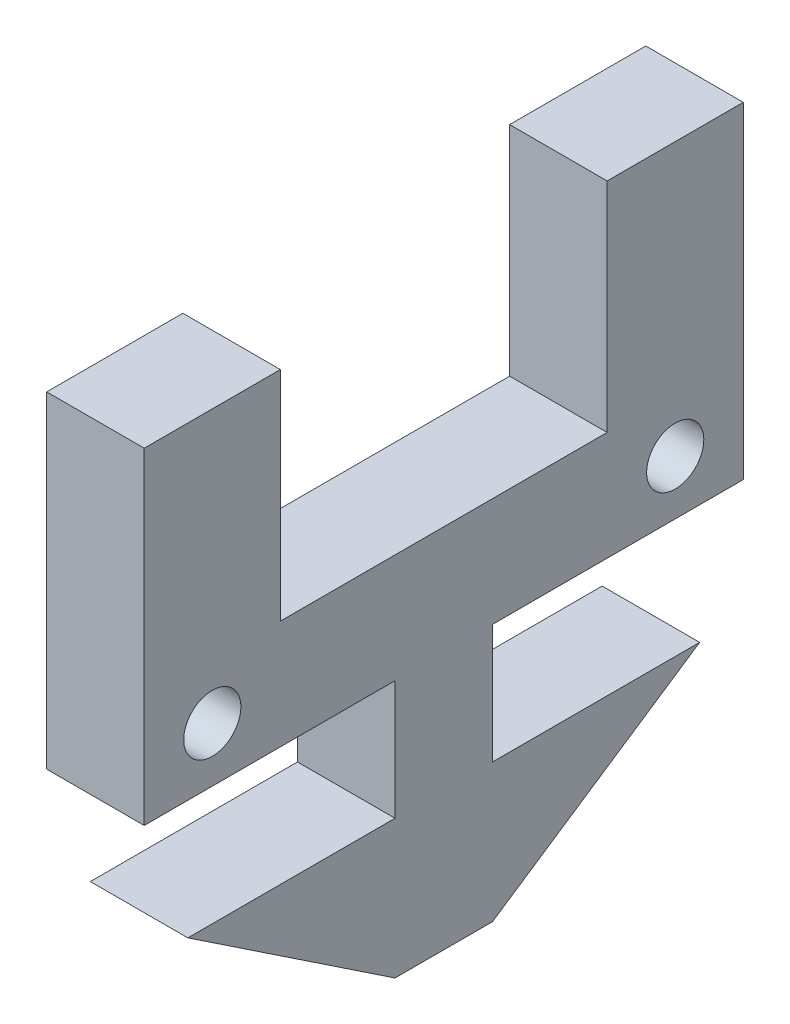
ISO-10303-21;
HEADER;
FILE_DESCRIPTION(('STEP AP214'),'2;1');
FILE_NAME('part.step','',(''),(''),'','','');
FILE_SCHEMA(('AUTOMOTIVE_DESIGN { 1 0 10303 214 1 1 1 1 }'));
ENDSEC;
DATA;
#1=APPLICATION_CONTEXT('core data for automotive mechanical design processes');
#2=APPLICATION_PROTOCOL_DEFINITION('international standard','automotive_design',2000,#1);
#3=PRODUCT_CONTEXT('',#1,'mechanical');
#4=PRODUCT('Part','Part','',(#3));
#5=PRODUCT_RELATED_PRODUCT_CATEGORY('part','',(#4));
#6=PRODUCT_DEFINITION_FORMATION('','',#4);
#7=PRODUCT_DEFINITION_CONTEXT('part definition',#1,'design');
#8=PRODUCT_DEFINITION('design','',#6,#7);
#9=PRODUCT_DEFINITION_SHAPE('','',#8);
#10=(LENGTH_UNIT() NAMED_UNIT(*) SI_UNIT(.MILLI.,.METRE.));
#11=(NAMED_UNIT(*) PLANE_ANGLE_UNIT() SI_UNIT($,.RADIAN.));
#12=(NAMED_UNIT(*) SI_UNIT($,.STERADIAN.) SOLID_ANGLE_UNIT());
#13=UNCERTAINTY_MEASURE_WITH_UNIT(LENGTH_MEASURE(1.E-05),#10,'distance_accuracy_value','');
#14=(GEOMETRIC_REPRESENTATION_CONTEXT(3) GLOBAL_UNCERTAINTY_ASSIGNED_CONTEXT((#13)) GLOBAL_UNIT_ASSIGNED_CONTEXT((#10,
#11,#12)) REPRESENTATION_CONTEXT('',''));
#15=CARTESIAN_POINT('',(0.,0.,0.));
#16=DIRECTION('',(0.,0.,1.));
#17=DIRECTION('',(1.,0.,0.));
#18=AXIS2_PLACEMENT_3D('',#15,#16,#17);
#19=CARTESIAN_POINT('',(3.5814,-6.,11.));
#20=DIRECTION('',(0.,1.,0.));
#21=DIRECTION('',(0.,0.,1.));
#22=AXIS2_PLACEMENT_3D('',#19,#20,#21);
#23=PLANE('',#22);
#24=DIRECTION('',(-1.,0.,0.));
#25=VECTOR('',#24,1.);
#26=CARTESIAN_POINT('',(24.6215187167755,-6.,1.7907));
#27=LINE('',#26,#25);
#28=CARTESIAN_POINT('',(3.5814,-6.,1.7907));
#29=VERTEX_POINT('',#28);
#30=CARTESIAN_POINT('',(0.,-6.,1.7907));
#31=VERTEX_POINT('',#30);
#32=EDGE_CURVE('E56',#29,#31,#27,.T.);
#33=ORIENTED_EDGE('',*,*,#32,.F.);
#34=DIRECTION('',(0.,0.,-1.));
#35=VECTOR('',#34,1.);
#36=CARTESIAN_POINT('',(3.5814,-6.,11.));
#37=LINE('',#36,#35);
#38=CARTESIAN_POINT('',(3.5814,-6.,11.));
#39=VERTEX_POINT('',#38);
#40=EDGE_CURVE('E230',#39,#29,#37,.T.);
#41=ORIENTED_EDGE('',*,*,#40,.F.);
#42=DIRECTION('',(-1.,0.,0.));
#43=VECTOR('',#42,1.);
#44=CARTESIAN_POINT('',(3.5814,-6.,11.));
#45=LINE('',#44,#43);
#46=CARTESIAN_POINT('',(0.,-6.,11.));
#47=VERTEX_POINT('',#46);
#48=EDGE_CURVE('E256',#39,#47,#45,.T.);
#49=ORIENTED_EDGE('',*,*,#48,.T.);
#50=DIRECTION('',(0.,0.,-1.));
#51=VECTOR('',#50,1.);
#52=CARTESIAN_POINT('',(0.,-6.,11.));
#53=LINE('',#52,#51);
#54=EDGE_CURVE('E248',#47,#31,#53,.T.);
#55=ORIENTED_EDGE('',*,*,#54,.T.);
#56=EDGE_LOOP('',(#33,#41,#49,#55));
#57=FACE_BOUND('',#56,.T.);
#58=ADVANCED_FACE('F33',(#57),#23,.F.);
#59=CARTESIAN_POINT('',(3.5814,6.,-6.));
#60=DIRECTION('',(0.,-1.,0.));
#61=DIRECTION('',(0.,0.,-1.));
#62=AXIS2_PLACEMENT_3D('',#59,#60,#61);
#63=PLANE('',#62);
#64=DIRECTION('',(0.,0.,1.));
#65=VECTOR('',#64,1.);
#66=CARTESIAN_POINT('',(0.,6.,-6.));
#67=LINE('',#66,#65);
#68=CARTESIAN_POINT('',(0.,6.,-11.));
#69=VERTEX_POINT('',#68);
#70=CARTESIAN_POINT('',(0.,6.,-6.));
#71=VERTEX_POINT('',#70);
#72=EDGE_CURVE('E211',#69,#71,#67,.T.);
#73=ORIENTED_EDGE('',*,*,#72,.T.);
#74=DIRECTION('',(-1.,0.,0.));
#75=VECTOR('',#74,1.);
#76=CARTESIAN_POINT('',(3.5814,6.,-6.));
#77=LINE('',#76,#75);
#78=CARTESIAN_POINT('',(3.5814,6.,-6.));
#79=VERTEX_POINT('',#78);
#80=EDGE_CURVE('E11',#79,#71,#77,.T.);
#81=ORIENTED_EDGE('',*,*,#80,.F.);
#82=DIRECTION('',(0.,0.,1.));
#83=VECTOR('',#82,1.);
#84=CARTESIAN_POINT('',(3.5814,6.,-6.));
#85=LINE('',#84,#83);
#86=CARTESIAN_POINT('',(3.5814,6.,-11.));
#87=VERTEX_POINT('',#86);
#88=EDGE_CURVE('E217',#87,#79,#85,.T.);
#89=ORIENTED_EDGE('',*,*,#88,.F.);
#90=DIRECTION('',(-1.,0.,0.));
#91=VECTOR('',#90,1.);
#92=CARTESIAN_POINT('',(3.5814,6.,-11.));
#93=LINE('',#92,#91);
#94=EDGE_CURVE('E234',#87,#69,#93,.T.);
#95=ORIENTED_EDGE('',*,*,#94,.T.);
#96=EDGE_LOOP('',(#73,#81,#89,#95));
#97=FACE_BOUND('',#96,.T.);
#98=ADVANCED_FACE('F35',(#97),#63,.F.);
#99=CARTESIAN_POINT('',(3.5814,-2.,-6.));
#100=DIRECTION('',(0.,0.,-1.));
#101=DIRECTION('',(0.,1.,0.));
#102=AXIS2_PLACEMENT_3D('',#99,#100,#101);
#103=PLANE('',#102);
#104=DIRECTION('',(0.,-1.,0.));
#105=VECTOR('',#104,1.);
#106=CARTESIAN_POINT('',(0.,-2.,-6.));
#107=LINE('',#106,#105);
#108=CARTESIAN_POINT('',(0.,-2.,-6.));
#109=VERTEX_POINT('',#108);
#110=EDGE_CURVE('E237',#71,#109,#107,.T.);
#111=ORIENTED_EDGE('',*,*,#110,.T.);
#112=DIRECTION('',(-1.,0.,0.));
#113=VECTOR('',#112,1.);
#114=CARTESIAN_POINT('',(3.5814,-2.,-6.));
#115=LINE('',#114,#113);
#116=CARTESIAN_POINT('',(3.5814,-2.,-6.));
#117=VERTEX_POINT('',#116);
#118=EDGE_CURVE('E41',#117,#109,#115,.T.);
#119=ORIENTED_EDGE('',*,*,#118,.F.);
#120=DIRECTION('',(0.,-1.,0.));
#121=VECTOR('',#120,1.);
#122=CARTESIAN_POINT('',(3.5814,-2.,-6.));
#123=LINE('',#122,#121);
#124=EDGE_CURVE('E219',#79,#117,#123,.T.);
#125=ORIENTED_EDGE('',*,*,#124,.F.);
#126=ORIENTED_EDGE('',*,*,#80,.T.);
#127=EDGE_LOOP('',(#111,#119,#125,#126));
#128=FACE_BOUND('',#127,.T.);
#129=ADVANCED_FACE('F293',(#128),#103,.F.);
#130=CARTESIAN_POINT('',(3.5814,-2.,6.));
#131=DIRECTION('',(0.,-1.,0.));
#132=DIRECTION('',(0.,0.,-1.));
#133=AXIS2_PLACEMENT_3D('',#130,#131,#132);
#134=PLANE('',#133);
#135=DIRECTION('',(0.,0.,1.));
#136=VECTOR('',#135,1.);
#137=CARTESIAN_POINT('',(0.,-2.,6.));
#138=LINE('',#137,#136);
#139=CARTESIAN_POINT('',(0.,-2.,6.));
#140=VERTEX_POINT('',#139);
#141=EDGE_CURVE('E239',#109,#140,#138,.T.);
#142=ORIENTED_EDGE('',*,*,#141,.T.);
#143=DIRECTION('',(-1.,0.,0.));
#144=VECTOR('',#143,1.);
#145=CARTESIAN_POINT('',(3.5814,-2.,6.));
#146=LINE('',#145,#144);
#147=CARTESIAN_POINT('',(3.5814,-2.,6.));
#148=VERTEX_POINT('',#147);
#149=EDGE_CURVE('E265',#148,#140,#146,.T.);
#150=ORIENTED_EDGE('',*,*,#149,.F.);
#151=DIRECTION('',(0.,0.,1.));
#152=VECTOR('',#151,1.);
#153=CARTESIAN_POINT('',(3.5814,-2.,6.));
#154=LINE('',#153,#152);
#155=EDGE_CURVE('E222',#117,#148,#154,.T.);
#156=ORIENTED_EDGE('',*,*,#155,.F.);
#157=ORIENTED_EDGE('',*,*,#118,.T.);
#158=EDGE_LOOP('',(#142,#150,#156,#157));
#159=FACE_BOUND('',#158,.T.);
#160=ADVANCED_FACE('F272',(#159),#134,.F.);
#161=CARTESIAN_POINT('',(3.5814,6.,6.));
#162=DIRECTION('',(0.,0.,1.));
#163=DIRECTION('',(0.,-1.,0.));
#164=AXIS2_PLACEMENT_3D('',#161,#162,#163);
#165=PLANE('',#164);
#166=DIRECTION('',(0.,1.,0.));
#167=VECTOR('',#166,1.);
#168=CARTESIAN_POINT('',(0.,6.,6.));
#169=LINE('',#168,#167);
#170=CARTESIAN_POINT('',(0.,6.,6.));
#171=VERTEX_POINT('',#170);
#172=EDGE_CURVE('E241',#140,#171,#169,.T.);
#173=ORIENTED_EDGE('',*,*,#172,.T.);
#174=DIRECTION('',(-1.,0.,0.));
#175=VECTOR('',#174,1.);
#176=CARTESIAN_POINT('',(3.5814,6.,6.));
#177=LINE('',#176,#175);
#178=CARTESIAN_POINT('',(3.5814,6.,6.));
#179=VERTEX_POINT('',#178);
#180=EDGE_CURVE('E262',#179,#171,#177,.T.);
#181=ORIENTED_EDGE('',*,*,#180,.F.);
#182=DIRECTION('',(0.,1.,0.));
#183=VECTOR('',#182,1.);
#184=CARTESIAN_POINT('',(3.5814,6.,6.));
#185=LINE('',#184,#183);
#186=EDGE_CURVE('E224',#148,#179,#185,.T.);
#187=ORIENTED_EDGE('',*,*,#186,.F.);
#188=ORIENTED_EDGE('',*,*,#149,.T.);
#189=EDGE_LOOP('',(#173,#181,#187,#188));
#190=FACE_BOUND('',#189,.T.);
#191=ADVANCED_FACE('F283',(#190),#165,.F.);
#192=CARTESIAN_POINT('',(3.5814,6.,11.));
#193=DIRECTION('',(0.,-1.,0.));
#194=DIRECTION('',(0.,0.,-1.));
#195=AXIS2_PLACEMENT_3D('',#192,#193,#194);
#196=PLANE('',#195);
#197=DIRECTION('',(0.,0.,1.));
#198=VECTOR('',#197,1.);
#199=CARTESIAN_POINT('',(0.,6.,11.));
#200=LINE('',#199,#198);
#201=CARTESIAN_POINT('',(0.,6.,11.));
#202=VERTEX_POINT('',#201);
#203=EDGE_CURVE('E243',#171,#202,#200,.T.);
#204=ORIENTED_EDGE('',*,*,#203,.T.);
#205=DIRECTION('',(-1.,0.,0.));
#206=VECTOR('',#205,1.);
#207=CARTESIAN_POINT('',(3.5814,6.,11.));
#208=LINE('',#207,#206);
#209=CARTESIAN_POINT('',(3.5814,6.,11.));
#210=VERTEX_POINT('',#209);
#211=EDGE_CURVE('E259',#210,#202,#208,.T.);
#212=ORIENTED_EDGE('',*,*,#211,.F.);
#213=DIRECTION('',(0.,0.,1.));
#214=VECTOR('',#213,1.);
#215=CARTESIAN_POINT('',(3.5814,6.,11.));
#216=LINE('',#215,#214);
#217=EDGE_CURVE('E226',#179,#210,#216,.T.);
#218=ORIENTED_EDGE('',*,*,#217,.F.);
#219=ORIENTED_EDGE('',*,*,#180,.T.);
#220=EDGE_LOOP('',(#204,#212,#218,#219));
#221=FACE_BOUND('',#220,.T.);
#222=ADVANCED_FACE('F287',(#221),#196,.F.);
#223=CARTESIAN_POINT('',(3.5814,-6.,11.));
#224=DIRECTION('',(0.,0.,-1.));
#225=DIRECTION('',(-1.,0.,0.));
#226=AXIS2_PLACEMENT_3D('',#223,#224,#225);
#227=PLANE('',#226);
#228=DIRECTION('',(0.,-1.,0.));
#229=VECTOR('',#228,1.);
#230=CARTESIAN_POINT('',(0.,-6.,11.));
#231=LINE('',#230,#229);
#232=EDGE_CURVE('E245',#202,#47,#231,.T.);
#233=ORIENTED_EDGE('',*,*,#232,.T.);
#234=ORIENTED_EDGE('',*,*,#48,.F.);
#235=DIRECTION('',(0.,-1.,0.));
#236=VECTOR('',#235,1.);
#237=CARTESIAN_POINT('',(3.5814,-6.,11.));
#238=LINE('',#237,#236);
#239=EDGE_CURVE('E228',#210,#39,#238,.T.);
#240=ORIENTED_EDGE('',*,*,#239,.F.);
#241=ORIENTED_EDGE('',*,*,#211,.T.);
#242=EDGE_LOOP('',(#233,#234,#240,#241));
#243=FACE_BOUND('',#242,.T.);
#244=ADVANCED_FACE('F333',(#243),#227,.F.);
#245=CARTESIAN_POINT('',(3.5814,-6.,-1.7907));
#246=VERTEX_POINT('',#245);
#247=CARTESIAN_POINT('',(3.5814,-6.,-11.));
#248=VERTEX_POINT('',#247);
#249=EDGE_CURVE('E48',#246,#248,#37,.T.);
#250=ORIENTED_EDGE('',*,*,#249,.F.);
#251=DIRECTION('',(-1.,0.,0.));
#252=VECTOR('',#251,1.);
#253=CARTESIAN_POINT('',(24.6215187167755,-6.,-1.7907));
#254=LINE('',#253,#252);
#255=CARTESIAN_POINT('',(0.,-6.,-1.7907));
#256=VERTEX_POINT('',#255);
#257=EDGE_CURVE('E195',#246,#256,#254,.T.);
#258=ORIENTED_EDGE('',*,*,#257,.T.);
#259=CARTESIAN_POINT('',(0.,-6.,-11.));
#260=VERTEX_POINT('',#259);
#261=EDGE_CURVE('E247',#256,#260,#53,.T.);
#262=ORIENTED_EDGE('',*,*,#261,.T.);
#263=DIRECTION('',(-1.,0.,0.));
#264=VECTOR('',#263,1.);
#265=CARTESIAN_POINT('',(3.5814,-6.,-11.));
#266=LINE('',#265,#264);
#267=EDGE_CURVE('E253',#248,#260,#266,.T.);
#268=ORIENTED_EDGE('',*,*,#267,.F.);
#269=EDGE_LOOP('',(#250,#258,#262,#268));
#270=FACE_BOUND('',#269,.T.);
#271=ADVANCED_FACE('F303',(#270),#23,.F.);
#272=CARTESIAN_POINT('',(3.5814,-6.,-11.));
#273=DIRECTION('',(0.,0.,1.));
#274=DIRECTION('',(1.,0.,0.));
#275=AXIS2_PLACEMENT_3D('',#272,#273,#274);
#276=PLANE('',#275);
#277=DIRECTION('',(0.,1.,0.));
#278=VECTOR('',#277,1.);
#279=CARTESIAN_POINT('',(0.,-6.,-11.));
#280=LINE('',#279,#278);
#281=EDGE_CURVE('E220',#260,#69,#280,.T.);
#282=ORIENTED_EDGE('',*,*,#281,.T.);
#283=ORIENTED_EDGE('',*,*,#94,.F.);
#284=DIRECTION('',(0.,1.,0.));
#285=VECTOR('',#284,1.);
#286=CARTESIAN_POINT('',(3.5814,-6.,-11.));
#287=LINE('',#286,#285);
#288=EDGE_CURVE('E232',#248,#87,#287,.T.);
#289=ORIENTED_EDGE('',*,*,#288,.F.);
#290=ORIENTED_EDGE('',*,*,#267,.T.);
#291=EDGE_LOOP('',(#282,#283,#289,#290));
#292=FACE_BOUND('',#291,.T.);
#293=ADVANCED_FACE('F301',(#292),#276,.F.);
#294=CARTESIAN_POINT('',(3.5814,0.,0.));
#295=DIRECTION('',(1.,0.,0.));
#296=DIRECTION('',(0.,0.,-1.));
#297=AXIS2_PLACEMENT_3D('',#294,#295,#296);
#298=PLANE('',#297);
#299=CARTESIAN_POINT('',(3.5814,-4.,8.5));
#300=DIRECTION('',(1.,0.,0.));
#301=DIRECTION('',(0.,0.,-1.));
#302=AXIS2_PLACEMENT_3D('',#299,#300,#301);
#303=CIRCLE('',#302,1.05);
#304=CARTESIAN_POINT('',(3.5814,-4.,7.45));
#305=VERTEX_POINT('',#304);
#306=EDGE_CURVE('E212',#305,#305,#303,.T.);
#307=ORIENTED_EDGE('',*,*,#306,.F.);
#308=EDGE_LOOP('',(#307));
#309=FACE_BOUND('',#308,.T.);
#310=CARTESIAN_POINT('',(3.5814,-4.,-8.5));
#311=DIRECTION('',(1.,0.,0.));
#312=DIRECTION('',(0.,0.,-1.));
#313=AXIS2_PLACEMENT_3D('',#310,#311,#312);
#314=CIRCLE('',#313,1.05);
#315=CARTESIAN_POINT('',(3.5814,-4.,-9.55));
#316=VERTEX_POINT('',#315);
#317=EDGE_CURVE('E173',#316,#316,#314,.T.);
#318=ORIENTED_EDGE('',*,*,#317,.F.);
#319=EDGE_LOOP('',(#318));
#320=FACE_BOUND('',#319,.T.);
#321=ORIENTED_EDGE('',*,*,#88,.T.);
#322=ORIENTED_EDGE('',*,*,#124,.T.);
#323=ORIENTED_EDGE('',*,*,#155,.T.);
#324=ORIENTED_EDGE('',*,*,#186,.T.);
#325=ORIENTED_EDGE('',*,*,#217,.T.);
#326=ORIENTED_EDGE('',*,*,#239,.T.);
#327=ORIENTED_EDGE('',*,*,#40,.T.);
#328=DIRECTION('',(0.,-1.,0.));
#329=VECTOR('',#328,1.);
#330=CARTESIAN_POINT('',(3.5814,-6.,1.7907));
#331=LINE('',#330,#329);
#332=CARTESIAN_POINT('',(3.5814,-10.3749976,1.7907));
#333=VERTEX_POINT('',#332);
#334=EDGE_CURVE('E185',#29,#333,#331,.T.);
#335=ORIENTED_EDGE('',*,*,#334,.T.);
#336=DIRECTION('',(0.,0.,1.));
#337=VECTOR('',#336,1.);
#338=CARTESIAN_POINT('',(3.5814,-10.3749976,1.7907));
#339=LINE('',#338,#337);
#340=CARTESIAN_POINT('',(3.5814,-10.3749976,9.398));
#341=VERTEX_POINT('',#340);
#342=EDGE_CURVE('E178',#333,#341,#339,.T.);
#343=ORIENTED_EDGE('',*,*,#342,.T.);
#344=DIRECTION('',(0.,-0.555340809590661,-0.831622862362014));
#345=VECTOR('',#344,1.);
#346=CARTESIAN_POINT('',(3.5814,-10.3749976,9.398));
#347=LINE('',#346,#345);
#348=CARTESIAN_POINT('',(3.5814,-15.4549976,1.7907));
#349=VERTEX_POINT('',#348);
#350=EDGE_CURVE('E172',#341,#349,#347,.T.);
#351=ORIENTED_EDGE('',*,*,#350,.T.);
#352=DIRECTION('',(0.,0.,-1.));
#353=VECTOR('',#352,1.);
#354=CARTESIAN_POINT('',(3.5814,-15.4549976,1.7907));
#355=LINE('',#354,#353);
#356=CARTESIAN_POINT('',(3.5814,-15.4549976,-1.7907));
#357=VERTEX_POINT('',#356);
#358=EDGE_CURVE('E150',#349,#357,#355,.T.);
#359=ORIENTED_EDGE('',*,*,#358,.T.);
#360=DIRECTION('',(0.,0.555340809590661,-0.831622862362014));
#361=VECTOR('',#360,1.);
#362=CARTESIAN_POINT('',(3.5814,-15.4549976,-1.7907));
#363=LINE('',#362,#361);
#364=CARTESIAN_POINT('',(3.5814,-10.3749976,-9.398));
#365=VERTEX_POINT('',#364);
#366=EDGE_CURVE('E160',#357,#365,#363,.T.);
#367=ORIENTED_EDGE('',*,*,#366,.T.);
#368=DIRECTION('',(0.,0.,1.));
#369=VECTOR('',#368,1.);
#370=CARTESIAN_POINT('',(3.5814,-10.3749976,-9.398));
#371=LINE('',#370,#369);
#372=CARTESIAN_POINT('',(3.5814,-10.3749976,-1.7907));
#373=VERTEX_POINT('',#372);
#374=EDGE_CURVE('E166',#365,#373,#371,.T.);
#375=ORIENTED_EDGE('',*,*,#374,.T.);
#376=DIRECTION('',(0.,1.,0.));
#377=VECTOR('',#376,1.);
#378=CARTESIAN_POINT('',(3.5814,-6.,-1.7907));
#379=LINE('',#378,#377);
#380=EDGE_CURVE('E188',#373,#246,#379,.T.);
#381=ORIENTED_EDGE('',*,*,#380,.T.);
#382=ORIENTED_EDGE('',*,*,#249,.T.);
#383=ORIENTED_EDGE('',*,*,#288,.T.);
#384=EDGE_LOOP('',(#321,#322,#323,#324,#325,#326,#327,#335,#343,#351,#359,#367,#375,#381,#382,#383));
#385=FACE_BOUND('',#384,.T.);
#386=ADVANCED_FACE('F170',(#309,#320,#385),#298,.T.);
#387=CARTESIAN_POINT('',(0.,0.,0.));
#388=DIRECTION('',(1.,0.,0.));
#389=DIRECTION('',(0.,0.,-1.));
#390=AXIS2_PLACEMENT_3D('',#387,#388,#389);
#391=PLANE('',#390);
#392=CARTESIAN_POINT('',(0.,-4.,8.5));
#393=DIRECTION('',(1.,0.,0.));
#394=DIRECTION('',(0.,0.,-1.));
#395=AXIS2_PLACEMENT_3D('',#392,#393,#394);
#396=CIRCLE('',#395,1.05);
#397=CARTESIAN_POINT('',(0.,-4.,7.45));
#398=VERTEX_POINT('',#397);
#399=EDGE_CURVE('E208',#398,#398,#396,.T.);
#400=ORIENTED_EDGE('',*,*,#399,.T.);
#401=EDGE_LOOP('',(#400));
#402=FACE_BOUND('',#401,.T.);
#403=CARTESIAN_POINT('',(0.,-4.,-8.5));
#404=DIRECTION('',(1.,0.,0.));
#405=DIRECTION('',(0.,0.,-1.));
#406=AXIS2_PLACEMENT_3D('',#403,#404,#405);
#407=CIRCLE('',#406,1.05);
#408=CARTESIAN_POINT('',(0.,-4.,-9.55));
#409=VERTEX_POINT('',#408);
#410=EDGE_CURVE('E176',#409,#409,#407,.T.);
#411=ORIENTED_EDGE('',*,*,#410,.T.);
#412=EDGE_LOOP('',(#411));
#413=FACE_BOUND('',#412,.T.);
#414=ORIENTED_EDGE('',*,*,#72,.F.);
#415=ORIENTED_EDGE('',*,*,#281,.F.);
#416=ORIENTED_EDGE('',*,*,#261,.F.);
#417=DIRECTION('',(0.,1.,0.));
#418=VECTOR('',#417,1.);
#419=CARTESIAN_POINT('',(0.,-6.,-1.7907));
#420=LINE('',#419,#418);
#421=CARTESIAN_POINT('',(0.,-10.3749976,-1.7907));
#422=VERTEX_POINT('',#421);
#423=EDGE_CURVE('E194',#422,#256,#420,.T.);
#424=ORIENTED_EDGE('',*,*,#423,.F.);
#425=DIRECTION('',(0.,0.,1.));
#426=VECTOR('',#425,1.);
#427=CARTESIAN_POINT('',(0.,-10.3749976,-9.398));
#428=LINE('',#427,#426);
#429=CARTESIAN_POINT('',(0.,-10.3749976,-9.398));
#430=VERTEX_POINT('',#429);
#431=EDGE_CURVE('E181',#430,#422,#428,.T.);
#432=ORIENTED_EDGE('',*,*,#431,.F.);
#433=DIRECTION('',(0.,0.55534080959066,-0.831622862362014));
#434=VECTOR('',#433,1.);
#435=CARTESIAN_POINT('',(0.,-15.4549976,-1.7907));
#436=LINE('',#435,#434);
#437=CARTESIAN_POINT('',(0.,-15.4549976,-1.7907));
#438=VERTEX_POINT('',#437);
#439=EDGE_CURVE('E157',#438,#430,#436,.T.);
#440=ORIENTED_EDGE('',*,*,#439,.F.);
#441=DIRECTION('',(0.,0.,-1.));
#442=VECTOR('',#441,1.);
#443=CARTESIAN_POINT('',(0.,-15.4549976,1.7907));
#444=LINE('',#443,#442);
#445=CARTESIAN_POINT('',(0.,-15.4549976,1.7907));
#446=VERTEX_POINT('',#445);
#447=EDGE_CURVE('E153',#446,#438,#444,.T.);
#448=ORIENTED_EDGE('',*,*,#447,.F.);
#449=DIRECTION('',(0.,-0.55534080959066,-0.831622862362014));
#450=VECTOR('',#449,1.);
#451=CARTESIAN_POINT('',(0.,-10.3749976,9.398));
#452=LINE('',#451,#450);
#453=CARTESIAN_POINT('',(0.,-10.3749976,9.398));
#454=VERTEX_POINT('',#453);
#455=EDGE_CURVE('E204',#454,#446,#452,.T.);
#456=ORIENTED_EDGE('',*,*,#455,.F.);
#457=DIRECTION('',(0.,0.,1.));
#458=VECTOR('',#457,1.);
#459=CARTESIAN_POINT('',(0.,-10.3749976,1.7907));
#460=LINE('',#459,#458);
#461=CARTESIAN_POINT('',(0.,-10.3749976,1.7907));
#462=VERTEX_POINT('',#461);
#463=EDGE_CURVE('E201',#462,#454,#460,.T.);
#464=ORIENTED_EDGE('',*,*,#463,.F.);
#465=DIRECTION('',(0.,-1.,0.));
#466=VECTOR('',#465,1.);
#467=CARTESIAN_POINT('',(0.,-6.,1.7907));
#468=LINE('',#467,#466);
#469=EDGE_CURVE('E198',#31,#462,#468,.T.);
#470=ORIENTED_EDGE('',*,*,#469,.F.);
#471=ORIENTED_EDGE('',*,*,#54,.F.);
#472=ORIENTED_EDGE('',*,*,#232,.F.);
#473=ORIENTED_EDGE('',*,*,#203,.F.);
#474=ORIENTED_EDGE('',*,*,#172,.F.);
#475=ORIENTED_EDGE('',*,*,#141,.F.);
#476=ORIENTED_EDGE('',*,*,#110,.F.);
#477=EDGE_LOOP('',(#414,#415,#416,#424,#432,#440,#448,#456,#464,#470,#471,#472,#473,#474,#475,#476));
#478=FACE_BOUND('',#477,.T.);
#479=ADVANCED_FACE('F278',(#402,#413,#478),#391,.F.);
#480=CARTESIAN_POINT('',(0.,-4.,-8.5));
#481=DIRECTION('',(1.,0.,0.));
#482=DIRECTION('',(0.,0.,-1.));
#483=AXIS2_PLACEMENT_3D('',#480,#481,#482);
#484=CYLINDRICAL_SURFACE('',#483,1.05);
#485=ORIENTED_EDGE('',*,*,#410,.F.);
#486=EDGE_LOOP('',(#485));
#487=FACE_BOUND('',#486,.T.);
#488=ORIENTED_EDGE('',*,*,#317,.T.);
#489=EDGE_LOOP('',(#488));
#490=FACE_BOUND('',#489,.T.);
#491=ADVANCED_FACE('F351',(#487,#490),#484,.F.);
#492=CARTESIAN_POINT('',(0.,-4.,8.5));
#493=DIRECTION('',(1.,0.,0.));
#494=DIRECTION('',(0.,0.,-1.));
#495=AXIS2_PLACEMENT_3D('',#492,#493,#494);
#496=CYLINDRICAL_SURFACE('',#495,1.05);
#497=ORIENTED_EDGE('',*,*,#399,.F.);
#498=EDGE_LOOP('',(#497));
#499=FACE_BOUND('',#498,.T.);
#500=ORIENTED_EDGE('',*,*,#306,.T.);
#501=EDGE_LOOP('',(#500));
#502=FACE_BOUND('',#501,.T.);
#503=ADVANCED_FACE('F358',(#499,#502),#496,.F.);
#504=CARTESIAN_POINT('',(24.6215187167755,-10.3749976,-9.398));
#505=DIRECTION('',(0.,-1.,0.));
#506=DIRECTION('',(0.,0.,-1.));
#507=AXIS2_PLACEMENT_3D('',#504,#505,#506);
#508=PLANE('',#507);
#509=ORIENTED_EDGE('',*,*,#374,.F.);
#510=DIRECTION('',(-1.,0.,0.));
#511=VECTOR('',#510,1.);
#512=CARTESIAN_POINT('',(24.6215187167755,-10.3749976,-9.398));
#513=LINE('',#512,#511);
#514=EDGE_CURVE('E162',#365,#430,#513,.T.);
#515=ORIENTED_EDGE('',*,*,#514,.T.);
#516=ORIENTED_EDGE('',*,*,#431,.T.);
#517=DIRECTION('',(-1.,0.,0.));
#518=VECTOR('',#517,1.);
#519=CARTESIAN_POINT('',(24.6215187167755,-10.3749976,-1.7907));
#520=LINE('',#519,#518);
#521=EDGE_CURVE('E192',#373,#422,#520,.T.);
#522=ORIENTED_EDGE('',*,*,#521,.F.);
#523=EDGE_LOOP('',(#509,#515,#516,#522));
#524=FACE_BOUND('',#523,.T.);
#525=ADVANCED_FACE('F308',(#524),#508,.F.);
#526=CARTESIAN_POINT('',(24.6215187167755,-6.,-1.7907));
#527=DIRECTION('',(0.,0.,1.));
#528=DIRECTION('',(0.,-1.,0.));
#529=AXIS2_PLACEMENT_3D('',#526,#527,#528);
#530=PLANE('',#529);
#531=ORIENTED_EDGE('',*,*,#380,.F.);
#532=ORIENTED_EDGE('',*,*,#521,.T.);
#533=ORIENTED_EDGE('',*,*,#423,.T.);
#534=ORIENTED_EDGE('',*,*,#257,.F.);
#535=EDGE_LOOP('',(#531,#532,#533,#534));
#536=FACE_BOUND('',#535,.T.);
#537=ADVANCED_FACE('F305',(#536),#530,.F.);
#538=CARTESIAN_POINT('',(24.6215187167755,-6.,1.7907));
#539=DIRECTION('',(0.,0.,-1.));
#540=DIRECTION('',(0.,1.,0.));
#541=AXIS2_PLACEMENT_3D('',#538,#539,#540);
#542=PLANE('',#541);
#543=ORIENTED_EDGE('',*,*,#334,.F.);
#544=ORIENTED_EDGE('',*,*,#32,.T.);
#545=ORIENTED_EDGE('',*,*,#469,.T.);
#546=DIRECTION('',(-1.,0.,0.));
#547=VECTOR('',#546,1.);
#548=CARTESIAN_POINT('',(24.6215187167755,-10.3749976,1.7907));
#549=LINE('',#548,#547);
#550=EDGE_CURVE('E199',#333,#462,#549,.T.);
#551=ORIENTED_EDGE('',*,*,#550,.F.);
#552=EDGE_LOOP('',(#543,#544,#545,#551));
#553=FACE_BOUND('',#552,.T.);
#554=ADVANCED_FACE('F330',(#553),#542,.F.);
#555=CARTESIAN_POINT('',(24.6215187167755,-10.3749976,1.7907));
#556=DIRECTION('',(0.,-1.,0.));
#557=DIRECTION('',(0.,0.,-1.));
#558=AXIS2_PLACEMENT_3D('',#555,#556,#557);
#559=PLANE('',#558);
#560=ORIENTED_EDGE('',*,*,#342,.F.);
#561=ORIENTED_EDGE('',*,*,#550,.T.);
#562=ORIENTED_EDGE('',*,*,#463,.T.);
#563=DIRECTION('',(-1.,0.,0.));
#564=VECTOR('',#563,1.);
#565=CARTESIAN_POINT('',(24.6215187167755,-10.3749976,9.398));
#566=LINE('',#565,#564);
#567=EDGE_CURVE('E202',#341,#454,#566,.T.);
#568=ORIENTED_EDGE('',*,*,#567,.F.);
#569=EDGE_LOOP('',(#560,#561,#562,#568));
#570=FACE_BOUND('',#569,.T.);
#571=ADVANCED_FACE('F326',(#570),#559,.F.);
#572=CARTESIAN_POINT('',(24.6215187167755,-10.3749976,9.398));
#573=DIRECTION('',(0.,0.831622862362014,-0.55534080959066));
#574=DIRECTION('',(0.,0.555340809590661,0.831622862362014));
#575=AXIS2_PLACEMENT_3D('',#572,#573,#574);
#576=PLANE('',#575);
#577=ORIENTED_EDGE('',*,*,#350,.F.);
#578=ORIENTED_EDGE('',*,*,#567,.T.);
#579=ORIENTED_EDGE('',*,*,#455,.T.);
#580=DIRECTION('',(-1.,0.,0.));
#581=VECTOR('',#580,1.);
#582=CARTESIAN_POINT('',(24.6215187167755,-15.4549976,1.7907));
#583=LINE('',#582,#581);
#584=EDGE_CURVE('E205',#349,#446,#583,.T.);
#585=ORIENTED_EDGE('',*,*,#584,.F.);
#586=EDGE_LOOP('',(#577,#578,#579,#585));
#587=FACE_BOUND('',#586,.T.);
#588=ADVANCED_FACE('F323',(#587),#576,.F.);
#589=CARTESIAN_POINT('',(24.6215187167755,-15.4549976,1.7907));
#590=DIRECTION('',(0.,1.,0.));
#591=DIRECTION('',(0.,0.,1.));
#592=AXIS2_PLACEMENT_3D('',#589,#590,#591);
#593=PLANE('',#592);
#594=ORIENTED_EDGE('',*,*,#358,.F.);
#595=ORIENTED_EDGE('',*,*,#584,.T.);
#596=ORIENTED_EDGE('',*,*,#447,.T.);
#597=DIRECTION('',(-1.,0.,0.));
#598=VECTOR('',#597,1.);
#599=CARTESIAN_POINT('',(24.6215187167755,-15.4549976,-1.7907));
#600=LINE('',#599,#598);
#601=EDGE_CURVE('E146',#357,#438,#600,.T.);
#602=ORIENTED_EDGE('',*,*,#601,.F.);
#603=EDGE_LOOP('',(#594,#595,#596,#602));
#604=FACE_BOUND('',#603,.T.);
#605=ADVANCED_FACE('F148',(#604),#593,.F.);
#606=CARTESIAN_POINT('',(24.6215187167755,-15.4549976,-1.7907));
#607=DIRECTION('',(0.,0.831622862362014,0.55534080959066));
#608=DIRECTION('',(0.,-0.555340809590661,0.831622862362014));
#609=AXIS2_PLACEMENT_3D('',#606,#607,#608);
#610=PLANE('',#609);
#611=ORIENTED_EDGE('',*,*,#366,.F.);
#612=ORIENTED_EDGE('',*,*,#601,.T.);
#613=ORIENTED_EDGE('',*,*,#439,.T.);
#614=ORIENTED_EDGE('',*,*,#514,.F.);
#615=EDGE_LOOP('',(#611,#612,#613,#614));
#616=FACE_BOUND('',#615,.T.);
#617=ADVANCED_FACE('F161',(#616),#610,.F.);
#618=CLOSED_SHELL('',(#58,#98,#129,#160,#191,#222,#244,#271,#293,#386,#479,#491,#503,#525,#537,
#554,#571,#588,#605,#617));
#619=MANIFOLD_SOLID_BREP('B2',#618);
#620=ADVANCED_BREP_SHAPE_REPRESENTATION('',(#18,#619),#14);
#621=SHAPE_DEFINITION_REPRESENTATION(#9,#620);
ENDSEC;
END-ISO-10303-21;
